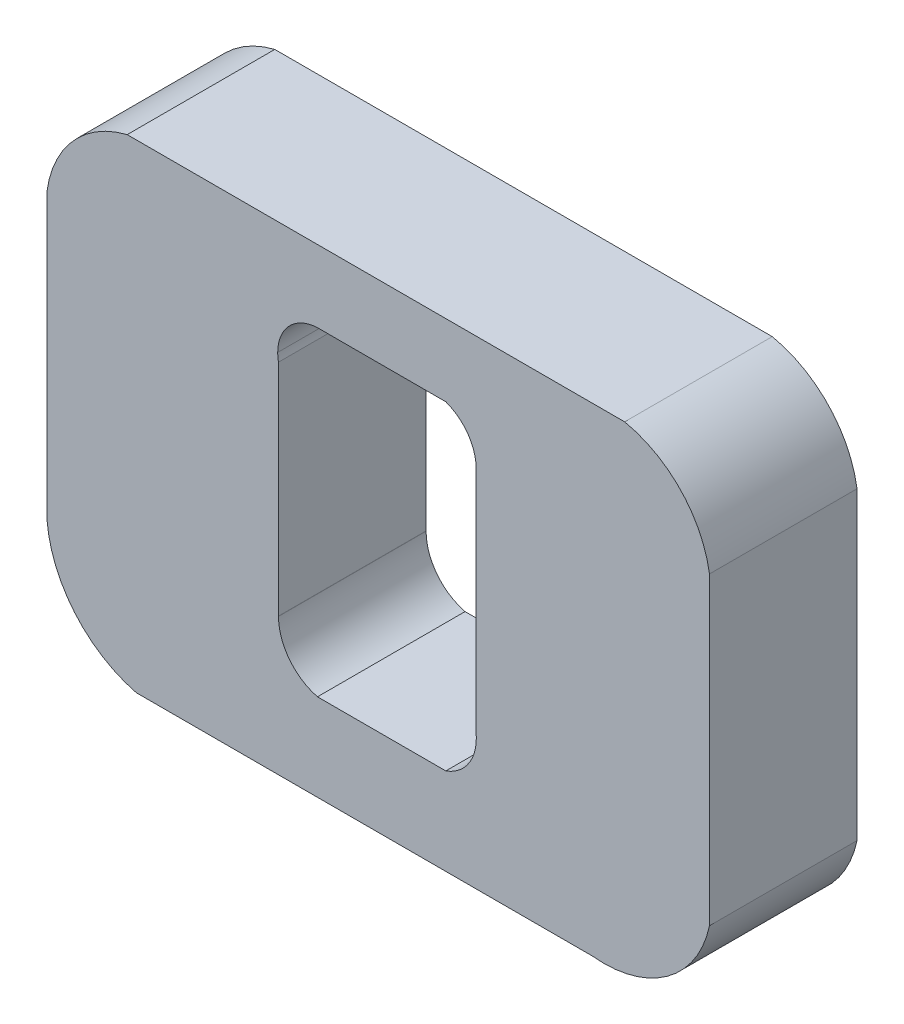
ISO-10303-21;
HEADER;
FILE_DESCRIPTION(('STEP AP214'),'2;1');
FILE_NAME('part.step','',(''),(''),'','','');
FILE_SCHEMA(('AUTOMOTIVE_DESIGN { 1 0 10303 214 1 1 1 1 }'));
ENDSEC;
DATA;
#1=APPLICATION_CONTEXT('core data for automotive mechanical design processes');
#2=APPLICATION_PROTOCOL_DEFINITION('international standard','automotive_design',2000,#1);
#3=PRODUCT_CONTEXT('',#1,'mechanical');
#4=PRODUCT('Part','Part','',(#3));
#5=PRODUCT_RELATED_PRODUCT_CATEGORY('part','',(#4));
#6=PRODUCT_DEFINITION_FORMATION('','',#4);
#7=PRODUCT_DEFINITION_CONTEXT('part definition',#1,'design');
#8=PRODUCT_DEFINITION('design','',#6,#7);
#9=PRODUCT_DEFINITION_SHAPE('','',#8);
#10=(LENGTH_UNIT() NAMED_UNIT(*) SI_UNIT(.MILLI.,.METRE.));
#11=(NAMED_UNIT(*) PLANE_ANGLE_UNIT() SI_UNIT($,.RADIAN.));
#12=(NAMED_UNIT(*) SI_UNIT($,.STERADIAN.) SOLID_ANGLE_UNIT());
#13=UNCERTAINTY_MEASURE_WITH_UNIT(LENGTH_MEASURE(1.E-05),#10,'distance_accuracy_value','');
#14=(GEOMETRIC_REPRESENTATION_CONTEXT(3) GLOBAL_UNCERTAINTY_ASSIGNED_CONTEXT((#13)) GLOBAL_UNIT_ASSIGNED_CONTEXT((#10,
#11,#12)) REPRESENTATION_CONTEXT('',''));
#15=CARTESIAN_POINT('',(0.,0.,0.));
#16=DIRECTION('',(0.,0.,1.));
#17=DIRECTION('',(1.,0.,0.));
#18=AXIS2_PLACEMENT_3D('',#15,#16,#17);
#19=CARTESIAN_POINT('',(-1.9393635236932,-18.1793191476775,69.4720552155059));
#20=DIRECTION('',(0.,0.,1.));
#21=DIRECTION('',(1.,0.,0.));
#22=AXIS2_PLACEMENT_3D('',#19,#20,#21);
#23=PLANE('',#22);
#24=DIRECTION('',(0.,-1.,0.));
#25=VECTOR('',#24,1.);
#26=CARTESIAN_POINT('',(-1.64471093498357,-17.5480655434369,69.4720552155059));
#27=LINE('',#26,#25);
#28=CARTESIAN_POINT('',(-1.64471093498357,-17.5480655434369,69.4720552155059));
#29=VERTEX_POINT('',#28);
#30=CARTESIAN_POINT('',(-1.64471093498357,-18.1217081782463,69.4720552155059));
#31=VERTEX_POINT('',#30);
#32=EDGE_CURVE('E385',#29,#31,#27,.T.);
#33=ORIENTED_EDGE('',*,*,#32,.T.);
#34=CARTESIAN_POINT('',(-1.50987489194818,-18.1224763428825,69.4720552155059));
#35=DIRECTION('',(0.,0.,1.));
#36=DIRECTION('',(1.,0.,0.));
#37=AXIS2_PLACEMENT_3D('',#34,#35,#36);
#38=CIRCLE('',#37,0.134838231145121);
#39=CARTESIAN_POINT('',(-1.6447131230933,-18.1224763428825,69.4720552155059));
#40=VERTEX_POINT('',#39);
#41=EDGE_CURVE('E317',#31,#40,#38,.T.);
#42=ORIENTED_EDGE('',*,*,#41,.T.);
#43=CARTESIAN_POINT('',(-1.50987489194818,-18.1224763428825,69.4720552155059));
#44=DIRECTION('',(0.,0.,1.));
#45=DIRECTION('',(1.,0.,0.));
#46=AXIS2_PLACEMENT_3D('',#43,#44,#45);
#47=CIRCLE('',#46,0.134838231145121);
#48=CARTESIAN_POINT('',(-1.54305702823963,-18.253167943261,69.4720552155059));
#49=VERTEX_POINT('',#48);
#50=EDGE_CURVE('E11',#40,#49,#47,.T.);
#51=ORIENTED_EDGE('',*,*,#50,.T.);
#52=DIRECTION('',(1.,0.,0.));
#53=VECTOR('',#52,1.);
#54=CARTESIAN_POINT('',(-1.54305702823869,-18.2531679432618,69.4720552155059));
#55=LINE('',#54,#53);
#56=CARTESIAN_POINT('',(-1.20819730965096,-18.2531679432618,69.4720552155059));
#57=VERTEX_POINT('',#56);
#58=EDGE_CURVE('E215',#49,#57,#55,.T.);
#59=ORIENTED_EDGE('',*,*,#58,.T.);
#60=CARTESIAN_POINT('',(-1.24873255736193,-18.1401110956377,69.4720552155059));
#61=DIRECTION('',(0.,0.,1.));
#62=DIRECTION('',(1.,0.,0.));
#63=AXIS2_PLACEMENT_3D('',#60,#61,#62);
#64=CIRCLE('',#63,0.120103942905845);
#65=CARTESIAN_POINT('',(-1.13004688117047,-18.1217081782465,69.4720552155059));
#66=VERTEX_POINT('',#65);
#67=EDGE_CURVE('E205',#57,#66,#64,.T.);
#68=ORIENTED_EDGE('',*,*,#67,.T.);
#69=DIRECTION('',(0.,1.,0.));
#70=VECTOR('',#69,1.);
#71=CARTESIAN_POINT('',(-1.13004688117,-18.1217081782463,69.4720552155059));
#72=LINE('',#71,#70);
#73=CARTESIAN_POINT('',(-1.13004688117,-17.5480655434369,69.4720552155059));
#74=VERTEX_POINT('',#73);
#75=EDGE_CURVE('E197',#66,#74,#72,.T.);
#76=ORIENTED_EDGE('',*,*,#75,.T.);
#77=CARTESIAN_POINT('',(-1.24807334481727,-17.5316071274858,69.4720552155059));
#78=DIRECTION('',(0.,0.,1.));
#79=DIRECTION('',(1.,0.,0.));
#80=AXIS2_PLACEMENT_3D('',#77,#78,#79);
#81=CIRCLE('',#80,0.119168475599196);
#82=CARTESIAN_POINT('',(-1.2081973096505,-17.4193082966993,69.4720552155059));
#83=VERTEX_POINT('',#82);
#84=EDGE_CURVE('E329',#74,#83,#81,.T.);
#85=ORIENTED_EDGE('',*,*,#84,.T.);
#86=DIRECTION('',(-1.,0.,0.));
#87=VECTOR('',#86,1.);
#88=CARTESIAN_POINT('',(-1.20819730965096,-17.4193082966993,69.4720552155059));
#89=LINE('',#88,#87);
#90=CARTESIAN_POINT('',(-1.54305702823869,-17.4193082966993,69.4720552155059));
#91=VERTEX_POINT('',#90);
#92=EDGE_CURVE('E333',#83,#91,#89,.T.);
#93=ORIENTED_EDGE('',*,*,#92,.T.);
#94=CARTESIAN_POINT('',(-1.53893723371053,-17.5270674033295,69.4720552155059));
#95=DIRECTION('',(0.,0.,1.));
#96=DIRECTION('',(1.,0.,0.));
#97=AXIS2_PLACEMENT_3D('',#94,#95,#96);
#98=CIRCLE('',#97,0.107837830879786);
#99=CARTESIAN_POINT('',(-1.64677506459031,-17.5270674033295,69.4720552155059));
#100=VERTEX_POINT('',#99);
#101=EDGE_CURVE('E381',#91,#100,#98,.T.);
#102=ORIENTED_EDGE('',*,*,#101,.T.);
#103=CARTESIAN_POINT('',(-1.53893723371053,-17.5270674033295,69.4720552155059));
#104=DIRECTION('',(0.,0.,1.));
#105=DIRECTION('',(1.,0.,0.));
#106=AXIS2_PLACEMENT_3D('',#103,#104,#105);
#107=CIRCLE('',#106,0.107837830879786);
#108=EDGE_CURVE('E357',#100,#29,#107,.T.);
#109=ORIENTED_EDGE('',*,*,#108,.T.);
#110=EDGE_LOOP('',(#33,#42,#51,#59,#68,#76,#85,#93,#102,#109));
#111=FACE_BOUND('',#110,.T.);
#112=DIRECTION('',(0.,-1.,0.));
#113=VECTOR('',#112,1.);
#114=CARTESIAN_POINT('',(-2.24865435820097,-17.4644093007314,69.4720552155059));
#115=LINE('',#114,#113);
#116=CARTESIAN_POINT('',(-2.24865435820097,-17.4644093007314,69.4720552155059));
#117=VERTEX_POINT('',#116);
#118=CARTESIAN_POINT('',(-2.24865435820097,-18.2053644209517,69.4720552155059));
#119=VERTEX_POINT('',#118);
#120=EDGE_CURVE('E225',#117,#119,#115,.T.);
#121=ORIENTED_EDGE('',*,*,#120,.F.);
#122=CARTESIAN_POINT('',(-1.97311280833625,-17.5013656888224,69.4720552155059));
#123=DIRECTION('',(0.,0.,1.));
#124=DIRECTION('',(1.,0.,0.));
#125=AXIS2_PLACEMENT_3D('',#122,#123,#124);
#126=CIRCLE('',#125,0.278008849360009);
#127=CARTESIAN_POINT('',(-2.03936701873062,-17.2313669852569,69.4720552155059));
#128=VERTEX_POINT('',#127);
#129=EDGE_CURVE('E167',#128,#117,#126,.T.);
#130=ORIENTED_EDGE('',*,*,#129,.F.);
#131=DIRECTION('',(-1.,0.,0.));
#132=VECTOR('',#131,1.);
#133=CARTESIAN_POINT('',(-0.741785563146615,-17.2313669852569,69.4720552155059));
#134=LINE('',#133,#132);
#135=CARTESIAN_POINT('',(-0.74178556314646,-17.2313669852567,69.4720552155059));
#136=VERTEX_POINT('',#135);
#137=EDGE_CURVE('E161',#136,#128,#134,.T.);
#138=ORIENTED_EDGE('',*,*,#137,.F.);
#139=CARTESIAN_POINT('',(-0.799573066802852,-17.5077746768139,69.4720552155059));
#140=DIRECTION('',(0.,0.,1.));
#141=DIRECTION('',(1.,0.,0.));
#142=AXIS2_PLACEMENT_3D('',#139,#140,#141);
#143=CIRCLE('',#142,0.282383794738376);
#144=CARTESIAN_POINT('',(-0.520538926080152,-17.4644093007314,69.4720552155059));
#145=VERTEX_POINT('',#144);
#146=EDGE_CURVE('E165',#145,#136,#143,.T.);
#147=ORIENTED_EDGE('',*,*,#146,.F.);
#148=DIRECTION('',(0.,1.,0.));
#149=VECTOR('',#148,1.);
#150=CARTESIAN_POINT('',(-0.520538926080152,-18.2591433966606,69.4720552155059));
#151=LINE('',#150,#149);
#152=CARTESIAN_POINT('',(-0.520538926080152,-18.2591433966603,69.4720552155059));
#153=VERTEX_POINT('',#152);
#154=EDGE_CURVE('E277',#153,#145,#151,.T.);
#155=ORIENTED_EDGE('',*,*,#154,.F.);
#156=CARTESIAN_POINT('',(-0.795650136791128,-18.2005393562921,69.4720552155059));
#157=DIRECTION('',(0.,0.,1.));
#158=DIRECTION('',(1.,0.,0.));
#159=AXIS2_PLACEMENT_3D('',#156,#157,#158);
#160=CIRCLE('',#159,0.281283863394903);
#161=CARTESIAN_POINT('',(-0.825500400679682,-18.4802348577797,69.4720552155059));
#162=VERTEX_POINT('',#161);
#163=EDGE_CURVE('E265',#162,#153,#160,.T.);
#164=ORIENTED_EDGE('',*,*,#163,.F.);
#165=DIRECTION('',(1.,0.,0.));
#166=VECTOR('',#165,1.);
#167=CARTESIAN_POINT('',(-2.01544842354118,-18.4802348577797,69.4720552155059));
#168=LINE('',#167,#166);
#169=CARTESIAN_POINT('',(-2.01544842354118,-18.4802348577794,69.4720552155059));
#170=VERTEX_POINT('',#169);
#171=EDGE_CURVE('E253',#170,#162,#168,.T.);
#172=ORIENTED_EDGE('',*,*,#171,.F.);
#173=CARTESIAN_POINT('',(-1.9393635236932,-18.1793191476775,69.4720552155059));
#174=DIRECTION('',(0.,0.,1.));
#175=DIRECTION('',(1.,0.,0.));
#176=AXIS2_PLACEMENT_3D('',#173,#174,#175);
#177=CIRCLE('',#176,0.310385528933008);
#178=EDGE_CURVE('E241',#119,#170,#177,.T.);
#179=ORIENTED_EDGE('',*,*,#178,.F.);
#180=EDGE_LOOP('',(#121,#130,#138,#147,#155,#164,#172,#179));
#181=FACE_BOUND('',#180,.T.);
#182=ADVANCED_FACE('F17',(#111,#181),#23,.F.);
#183=CARTESIAN_POINT('',(-1.9393635236932,-18.1793191476775,69.8570552155059));
#184=DIRECTION('',(0.,0.,1.));
#185=DIRECTION('',(1.,0.,0.));
#186=AXIS2_PLACEMENT_3D('',#183,#184,#185);
#187=PLANE('',#186);
#188=DIRECTION('',(0.,-1.,0.));
#189=VECTOR('',#188,1.);
#190=CARTESIAN_POINT('',(-1.64471093498357,-17.5480655434369,69.8570552155059));
#191=LINE('',#190,#189);
#192=CARTESIAN_POINT('',(-1.64471093498357,-17.5480655434369,69.8570552155059));
#193=VERTEX_POINT('',#192);
#194=CARTESIAN_POINT('',(-1.64471093498357,-18.1217081782463,69.8570552155059));
#195=VERTEX_POINT('',#194);
#196=EDGE_CURVE('E393',#193,#195,#191,.T.);
#197=ORIENTED_EDGE('',*,*,#196,.F.);
#198=CARTESIAN_POINT('',(-1.53893723371053,-17.5270674033295,69.8570552155059));
#199=DIRECTION('',(0.,0.,1.));
#200=DIRECTION('',(0.,-1.,0.));
#201=AXIS2_PLACEMENT_3D('',#198,#199,#200);
#202=CIRCLE('',#201,0.107837830879785);
#203=CARTESIAN_POINT('',(-1.64677506459031,-17.5270674033295,69.8570552155059));
#204=VERTEX_POINT('',#203);
#205=EDGE_CURVE('E363',#204,#193,#202,.T.);
#206=ORIENTED_EDGE('',*,*,#205,.F.);
#207=CARTESIAN_POINT('',(-1.53893723371053,-17.5270674033295,69.8570552155059));
#208=DIRECTION('',(0.,0.,1.));
#209=DIRECTION('',(0.,-1.,0.));
#210=AXIS2_PLACEMENT_3D('',#207,#208,#209);
#211=CIRCLE('',#210,0.107837830879785);
#212=CARTESIAN_POINT('',(-1.54305702823869,-17.4193082966993,69.8570552155059));
#213=VERTEX_POINT('',#212);
#214=EDGE_CURVE('E373',#213,#204,#211,.T.);
#215=ORIENTED_EDGE('',*,*,#214,.F.);
#216=DIRECTION('',(-1.,0.,0.));
#217=VECTOR('',#216,1.);
#218=CARTESIAN_POINT('',(-1.20819730965096,-17.4193082966993,69.8570552155059));
#219=LINE('',#218,#217);
#220=CARTESIAN_POINT('',(-1.2081973096505,-17.4193082966993,69.8570552155059));
#221=VERTEX_POINT('',#220);
#222=EDGE_CURVE('E341',#221,#213,#219,.T.);
#223=ORIENTED_EDGE('',*,*,#222,.F.);
#224=CARTESIAN_POINT('',(-1.24807334481727,-17.5316071274858,69.8570552155059));
#225=DIRECTION('',(0.,0.,1.));
#226=DIRECTION('',(0.,-1.,0.));
#227=AXIS2_PLACEMENT_3D('',#224,#225,#226);
#228=CIRCLE('',#227,0.119168475599195);
#229=CARTESIAN_POINT('',(-1.13004688117,-17.5480655434369,69.8570552155059));
#230=VERTEX_POINT('',#229);
#231=EDGE_CURVE('E347',#230,#221,#228,.T.);
#232=ORIENTED_EDGE('',*,*,#231,.F.);
#233=DIRECTION('',(0.,1.,0.));
#234=VECTOR('',#233,1.);
#235=CARTESIAN_POINT('',(-1.13004688117,-18.1217081782463,69.8570552155059));
#236=LINE('',#235,#234);
#237=CARTESIAN_POINT('',(-1.13004688117047,-18.1217081782465,69.8570552155059));
#238=VERTEX_POINT('',#237);
#239=EDGE_CURVE('E202',#238,#230,#236,.T.);
#240=ORIENTED_EDGE('',*,*,#239,.F.);
#241=CARTESIAN_POINT('',(-1.24873255736193,-18.1401110956377,69.8570552155059));
#242=DIRECTION('',(0.,0.,1.));
#243=DIRECTION('',(0.,-1.,0.));
#244=AXIS2_PLACEMENT_3D('',#241,#242,#243);
#245=CIRCLE('',#244,0.120103942905844);
#246=CARTESIAN_POINT('',(-1.20819730965096,-18.2531679432618,69.8570552155059));
#247=VERTEX_POINT('',#246);
#248=EDGE_CURVE('E212',#247,#238,#245,.T.);
#249=ORIENTED_EDGE('',*,*,#248,.F.);
#250=DIRECTION('',(1.,0.,0.));
#251=VECTOR('',#250,1.);
#252=CARTESIAN_POINT('',(-1.54305702823869,-18.2531679432618,69.8570552155059));
#253=LINE('',#252,#251);
#254=CARTESIAN_POINT('',(-1.54305702823963,-18.253167943261,69.8570552155059));
#255=VERTEX_POINT('',#254);
#256=EDGE_CURVE('E222',#255,#247,#253,.T.);
#257=ORIENTED_EDGE('',*,*,#256,.F.);
#258=CARTESIAN_POINT('',(-1.50987489194818,-18.1224763428825,69.8570552155059));
#259=DIRECTION('',(0.,0.,1.));
#260=DIRECTION('',(0.,-1.,0.));
#261=AXIS2_PLACEMENT_3D('',#258,#259,#260);
#262=CIRCLE('',#261,0.134838231145122);
#263=CARTESIAN_POINT('',(-1.6447131230933,-18.1224763428825,69.8570552155059));
#264=VERTEX_POINT('',#263);
#265=EDGE_CURVE('E26',#264,#255,#262,.T.);
#266=ORIENTED_EDGE('',*,*,#265,.F.);
#267=CARTESIAN_POINT('',(-1.50987489194818,-18.1224763428825,69.8570552155059));
#268=DIRECTION('',(0.,0.,1.));
#269=DIRECTION('',(0.,-1.,0.));
#270=AXIS2_PLACEMENT_3D('',#267,#268,#269);
#271=CIRCLE('',#270,0.134838231145122);
#272=EDGE_CURVE('E511',#195,#264,#271,.T.);
#273=ORIENTED_EDGE('',*,*,#272,.F.);
#274=EDGE_LOOP('',(#197,#206,#215,#223,#232,#240,#249,#257,#266,#273));
#275=FACE_BOUND('',#274,.T.);
#276=DIRECTION('',(0.,-1.,0.));
#277=VECTOR('',#276,1.);
#278=CARTESIAN_POINT('',(-2.24865435820097,-17.4644093007314,69.8570552155059));
#279=LINE('',#278,#277);
#280=CARTESIAN_POINT('',(-2.24865435820097,-17.4644093007314,69.8570552155059));
#281=VERTEX_POINT('',#280);
#282=CARTESIAN_POINT('',(-2.24865435820097,-18.2053644209517,69.8570552155059));
#283=VERTEX_POINT('',#282);
#284=EDGE_CURVE('E233',#281,#283,#279,.T.);
#285=ORIENTED_EDGE('',*,*,#284,.T.);
#286=CARTESIAN_POINT('',(-1.9393635236932,-18.1793191476775,69.8570552155059));
#287=DIRECTION('',(0.,0.,1.));
#288=DIRECTION('',(0.,-1.,0.));
#289=AXIS2_PLACEMENT_3D('',#286,#287,#288);
#290=CIRCLE('',#289,0.310385528933008);
#291=CARTESIAN_POINT('',(-2.01544842354118,-18.4802348577794,69.8570552155059));
#292=VERTEX_POINT('',#291);
#293=EDGE_CURVE('E249',#283,#292,#290,.T.);
#294=ORIENTED_EDGE('',*,*,#293,.T.);
#295=DIRECTION('',(1.,0.,0.));
#296=VECTOR('',#295,1.);
#297=CARTESIAN_POINT('',(-2.01544842354118,-18.4802348577797,69.8570552155059));
#298=LINE('',#297,#296);
#299=CARTESIAN_POINT('',(-0.825500400679682,-18.4802348577797,69.8570552155059));
#300=VERTEX_POINT('',#299);
#301=EDGE_CURVE('E261',#292,#300,#298,.T.);
#302=ORIENTED_EDGE('',*,*,#301,.T.);
#303=CARTESIAN_POINT('',(-0.795650136791128,-18.2005393562921,69.8570552155059));
#304=DIRECTION('',(0.,0.,1.));
#305=DIRECTION('',(0.,-1.,0.));
#306=AXIS2_PLACEMENT_3D('',#303,#304,#305);
#307=CIRCLE('',#306,0.281283863394904);
#308=CARTESIAN_POINT('',(-0.520538926080152,-18.2591433966603,69.8570552155059));
#309=VERTEX_POINT('',#308);
#310=EDGE_CURVE('E273',#300,#309,#307,.T.);
#311=ORIENTED_EDGE('',*,*,#310,.T.);
#312=DIRECTION('',(0.,1.,0.));
#313=VECTOR('',#312,1.);
#314=CARTESIAN_POINT('',(-0.520538926080152,-18.2591433966606,69.8570552155059));
#315=LINE('',#314,#313);
#316=CARTESIAN_POINT('',(-0.520538926080152,-17.4644093007314,69.8570552155059));
#317=VERTEX_POINT('',#316);
#318=EDGE_CURVE('E187',#309,#317,#315,.T.);
#319=ORIENTED_EDGE('',*,*,#318,.T.);
#320=CARTESIAN_POINT('',(-0.799573066802852,-17.5077746768139,69.8570552155059));
#321=DIRECTION('',(0.,0.,1.));
#322=DIRECTION('',(0.,-1.,0.));
#323=AXIS2_PLACEMENT_3D('',#320,#321,#322);
#324=CIRCLE('',#323,0.282383794738376);
#325=CARTESIAN_POINT('',(-0.74178556314646,-17.2313669852567,69.8570552155059));
#326=VERTEX_POINT('',#325);
#327=EDGE_CURVE('E172',#317,#326,#324,.T.);
#328=ORIENTED_EDGE('',*,*,#327,.T.);
#329=DIRECTION('',(-1.,0.,0.));
#330=VECTOR('',#329,1.);
#331=CARTESIAN_POINT('',(-0.741785563146615,-17.2313669852569,69.8570552155059));
#332=LINE('',#331,#330);
#333=CARTESIAN_POINT('',(-2.03936701873062,-17.2313669852569,69.8570552155059));
#334=VERTEX_POINT('',#333);
#335=EDGE_CURVE('E177',#326,#334,#332,.T.);
#336=ORIENTED_EDGE('',*,*,#335,.T.);
#337=CARTESIAN_POINT('',(-1.97311280833625,-17.5013656888224,69.8570552155059));
#338=DIRECTION('',(0.,0.,1.));
#339=DIRECTION('',(0.,-1.,0.));
#340=AXIS2_PLACEMENT_3D('',#337,#338,#339);
#341=CIRCLE('',#340,0.278008849360009);
#342=EDGE_CURVE('E38',#334,#281,#341,.T.);
#343=ORIENTED_EDGE('',*,*,#342,.T.);
#344=EDGE_LOOP('',(#285,#294,#302,#311,#319,#328,#336,#343));
#345=FACE_BOUND('',#344,.T.);
#346=ADVANCED_FACE('F305',(#275,#345),#187,.T.);
#347=CARTESIAN_POINT('',(-1.50987489194818,-18.1224763428825,69.8220552155059));
#348=DIRECTION('',(0.,0.,-1.));
#349=DIRECTION('',(-1.,0.,0.));
#350=AXIS2_PLACEMENT_3D('',#347,#348,#349);
#351=CYLINDRICAL_SURFACE('',#350,0.134838231145121);
#352=DIRECTION('',(0.,0.,-1.));
#353=VECTOR('',#352,1.);
#354=CARTESIAN_POINT('',(-1.6447131230933,-18.1224763428825,69.8220552155059));
#355=LINE('',#354,#353);
#356=EDGE_CURVE('E299',#264,#40,#355,.T.);
#357=ORIENTED_EDGE('',*,*,#356,.F.);
#358=ORIENTED_EDGE('',*,*,#265,.T.);
#359=DIRECTION('',(0.,0.,-1.));
#360=VECTOR('',#359,1.);
#361=CARTESIAN_POINT('',(-1.54305702823963,-18.253167943261,69.8220552155059));
#362=LINE('',#361,#360);
#363=EDGE_CURVE('E218',#255,#49,#362,.T.);
#364=ORIENTED_EDGE('',*,*,#363,.T.);
#365=ORIENTED_EDGE('',*,*,#50,.F.);
#366=EDGE_LOOP('',(#357,#358,#364,#365));
#367=FACE_BOUND('',#366,.T.);
#368=ADVANCED_FACE('F293',(#367),#351,.F.);
#369=CARTESIAN_POINT('',(-1.97311280833625,-17.5013656888224,69.8220552155059));
#370=DIRECTION('',(0.,0.,-1.));
#371=DIRECTION('',(-1.,0.,0.));
#372=AXIS2_PLACEMENT_3D('',#369,#370,#371);
#373=CYLINDRICAL_SURFACE('',#372,0.278008849360009);
#374=ORIENTED_EDGE('',*,*,#129,.T.);
#375=DIRECTION('',(0.,0.,-1.));
#376=VECTOR('',#375,1.);
#377=CARTESIAN_POINT('',(-2.24865435820097,-17.4644093007314,69.8220552155059));
#378=LINE('',#377,#376);
#379=EDGE_CURVE('E237',#281,#117,#378,.T.);
#380=ORIENTED_EDGE('',*,*,#379,.F.);
#381=ORIENTED_EDGE('',*,*,#342,.F.);
#382=DIRECTION('',(0.,0.,-1.));
#383=VECTOR('',#382,1.);
#384=CARTESIAN_POINT('',(-2.03936701873062,-17.2313669852569,69.8220552155059));
#385=LINE('',#384,#383);
#386=EDGE_CURVE('E171',#334,#128,#385,.T.);
#387=ORIENTED_EDGE('',*,*,#386,.T.);
#388=EDGE_LOOP('',(#374,#380,#381,#387));
#389=FACE_BOUND('',#388,.T.);
#390=ADVANCED_FACE('F425',(#389),#373,.T.);
#391=CARTESIAN_POINT('',(-0.741785563146615,-17.2313669852569,69.8220552155059));
#392=DIRECTION('',(0.,-1.,0.));
#393=DIRECTION('',(0.,0.,-1.));
#394=AXIS2_PLACEMENT_3D('',#391,#392,#393);
#395=PLANE('',#394);
#396=ORIENTED_EDGE('',*,*,#137,.T.);
#397=ORIENTED_EDGE('',*,*,#386,.F.);
#398=ORIENTED_EDGE('',*,*,#335,.F.);
#399=DIRECTION('',(0.,0.,-1.));
#400=VECTOR('',#399,1.);
#401=CARTESIAN_POINT('',(-0.74178556314646,-17.2313669852567,69.8220552155059));
#402=LINE('',#401,#400);
#403=EDGE_CURVE('E175',#326,#136,#402,.T.);
#404=ORIENTED_EDGE('',*,*,#403,.T.);
#405=EDGE_LOOP('',(#396,#397,#398,#404));
#406=FACE_BOUND('',#405,.T.);
#407=ADVANCED_FACE('F176',(#406),#395,.F.);
#408=CARTESIAN_POINT('',(-0.799573066802852,-17.5077746768139,69.8220552155059));
#409=DIRECTION('',(0.,0.,-1.));
#410=DIRECTION('',(-1.,0.,0.));
#411=AXIS2_PLACEMENT_3D('',#408,#409,#410);
#412=CYLINDRICAL_SURFACE('',#411,0.282383794738376);
#413=ORIENTED_EDGE('',*,*,#146,.T.);
#414=ORIENTED_EDGE('',*,*,#403,.F.);
#415=ORIENTED_EDGE('',*,*,#327,.F.);
#416=DIRECTION('',(0.,0.,-1.));
#417=VECTOR('',#416,1.);
#418=CARTESIAN_POINT('',(-0.520538926080152,-17.4644093007314,69.8220552155059));
#419=LINE('',#418,#417);
#420=EDGE_CURVE('E184',#317,#145,#419,.T.);
#421=ORIENTED_EDGE('',*,*,#420,.T.);
#422=EDGE_LOOP('',(#413,#414,#415,#421));
#423=FACE_BOUND('',#422,.T.);
#424=ADVANCED_FACE('F182',(#423),#412,.T.);
#425=CARTESIAN_POINT('',(-0.520538926080152,-18.2591433966606,69.8220552155059));
#426=DIRECTION('',(-1.,0.,0.));
#427=DIRECTION('',(0.,0.,1.));
#428=AXIS2_PLACEMENT_3D('',#425,#426,#427);
#429=PLANE('',#428);
#430=ORIENTED_EDGE('',*,*,#154,.T.);
#431=ORIENTED_EDGE('',*,*,#420,.F.);
#432=ORIENTED_EDGE('',*,*,#318,.F.);
#433=DIRECTION('',(0.,0.,-1.));
#434=VECTOR('',#433,1.);
#435=CARTESIAN_POINT('',(-0.520538926080152,-18.2591433966603,69.8220552155059));
#436=LINE('',#435,#434);
#437=EDGE_CURVE('E269',#309,#153,#436,.T.);
#438=ORIENTED_EDGE('',*,*,#437,.T.);
#439=EDGE_LOOP('',(#430,#431,#432,#438));
#440=FACE_BOUND('',#439,.T.);
#441=ADVANCED_FACE('F436',(#440),#429,.F.);
#442=CARTESIAN_POINT('',(-0.795650136791128,-18.2005393562921,69.8220552155059));
#443=DIRECTION('',(0.,0.,-1.));
#444=DIRECTION('',(-1.,0.,0.));
#445=AXIS2_PLACEMENT_3D('',#442,#443,#444);
#446=CYLINDRICAL_SURFACE('',#445,0.281283863394903);
#447=ORIENTED_EDGE('',*,*,#163,.T.);
#448=ORIENTED_EDGE('',*,*,#437,.F.);
#449=ORIENTED_EDGE('',*,*,#310,.F.);
#450=DIRECTION('',(0.,0.,-1.));
#451=VECTOR('',#450,1.);
#452=CARTESIAN_POINT('',(-0.825500400679682,-18.4802348577797,69.8220552155059));
#453=LINE('',#452,#451);
#454=EDGE_CURVE('E257',#300,#162,#453,.T.);
#455=ORIENTED_EDGE('',*,*,#454,.T.);
#456=EDGE_LOOP('',(#447,#448,#449,#455));
#457=FACE_BOUND('',#456,.T.);
#458=ADVANCED_FACE('F439',(#457),#446,.T.);
#459=CARTESIAN_POINT('',(-2.01544842354118,-18.4802348577797,69.8220552155059));
#460=DIRECTION('',(0.,1.,0.));
#461=DIRECTION('',(1.,0.,0.));
#462=AXIS2_PLACEMENT_3D('',#459,#460,#461);
#463=PLANE('',#462);
#464=ORIENTED_EDGE('',*,*,#171,.T.);
#465=ORIENTED_EDGE('',*,*,#454,.F.);
#466=ORIENTED_EDGE('',*,*,#301,.F.);
#467=DIRECTION('',(0.,0.,-1.));
#468=VECTOR('',#467,1.);
#469=CARTESIAN_POINT('',(-2.01544842354118,-18.4802348577794,69.8220552155059));
#470=LINE('',#469,#468);
#471=EDGE_CURVE('E245',#292,#170,#470,.T.);
#472=ORIENTED_EDGE('',*,*,#471,.T.);
#473=EDGE_LOOP('',(#464,#465,#466,#472));
#474=FACE_BOUND('',#473,.T.);
#475=ADVANCED_FACE('F441',(#474),#463,.F.);
#476=CARTESIAN_POINT('',(-1.9393635236932,-18.1793191476775,69.8220552155059));
#477=DIRECTION('',(0.,0.,-1.));
#478=DIRECTION('',(-1.,0.,0.));
#479=AXIS2_PLACEMENT_3D('',#476,#477,#478);
#480=CYLINDRICAL_SURFACE('',#479,0.310385528933008);
#481=ORIENTED_EDGE('',*,*,#178,.T.);
#482=ORIENTED_EDGE('',*,*,#471,.F.);
#483=ORIENTED_EDGE('',*,*,#293,.F.);
#484=DIRECTION('',(0.,0.,-1.));
#485=VECTOR('',#484,1.);
#486=CARTESIAN_POINT('',(-2.24865435820097,-18.2053644209517,69.8220552155059));
#487=LINE('',#486,#485);
#488=EDGE_CURVE('E229',#283,#119,#487,.T.);
#489=ORIENTED_EDGE('',*,*,#488,.T.);
#490=EDGE_LOOP('',(#481,#482,#483,#489));
#491=FACE_BOUND('',#490,.T.);
#492=ADVANCED_FACE('F433',(#491),#480,.T.);
#493=CARTESIAN_POINT('',(-2.24865435820097,-17.4644093007314,69.8220552155059));
#494=DIRECTION('',(1.,0.,0.));
#495=DIRECTION('',(0.,1.,0.));
#496=AXIS2_PLACEMENT_3D('',#493,#494,#495);
#497=PLANE('',#496);
#498=ORIENTED_EDGE('',*,*,#120,.T.);
#499=ORIENTED_EDGE('',*,*,#488,.F.);
#500=ORIENTED_EDGE('',*,*,#284,.F.);
#501=ORIENTED_EDGE('',*,*,#379,.T.);
#502=EDGE_LOOP('',(#498,#499,#500,#501));
#503=FACE_BOUND('',#502,.T.);
#504=ADVANCED_FACE('F429',(#503),#497,.F.);
#505=CARTESIAN_POINT('',(-1.54305702823869,-18.2531679432618,69.8220552155059));
#506=DIRECTION('',(0.,1.,0.));
#507=DIRECTION('',(1.,0.,0.));
#508=AXIS2_PLACEMENT_3D('',#505,#506,#507);
#509=PLANE('',#508);
#510=ORIENTED_EDGE('',*,*,#58,.F.);
#511=ORIENTED_EDGE('',*,*,#363,.F.);
#512=ORIENTED_EDGE('',*,*,#256,.T.);
#513=DIRECTION('',(0.,0.,-1.));
#514=VECTOR('',#513,1.);
#515=CARTESIAN_POINT('',(-1.20819730965096,-18.2531679432618,69.8220552155059));
#516=LINE('',#515,#514);
#517=EDGE_CURVE('E208',#247,#57,#516,.T.);
#518=ORIENTED_EDGE('',*,*,#517,.T.);
#519=EDGE_LOOP('',(#510,#511,#512,#518));
#520=FACE_BOUND('',#519,.T.);
#521=ADVANCED_FACE('F310',(#520),#509,.T.);
#522=CARTESIAN_POINT('',(-1.24873255736193,-18.1401110956377,69.8220552155059));
#523=DIRECTION('',(0.,0.,-1.));
#524=DIRECTION('',(-1.,0.,0.));
#525=AXIS2_PLACEMENT_3D('',#522,#523,#524);
#526=CYLINDRICAL_SURFACE('',#525,0.120103942905845);
#527=ORIENTED_EDGE('',*,*,#67,.F.);
#528=ORIENTED_EDGE('',*,*,#517,.F.);
#529=ORIENTED_EDGE('',*,*,#248,.T.);
#530=DIRECTION('',(0.,0.,-1.));
#531=VECTOR('',#530,1.);
#532=CARTESIAN_POINT('',(-1.13004688117047,-18.1217081782465,69.8220552155059));
#533=LINE('',#532,#531);
#534=EDGE_CURVE('E199',#238,#66,#533,.T.);
#535=ORIENTED_EDGE('',*,*,#534,.T.);
#536=EDGE_LOOP('',(#527,#528,#529,#535));
#537=FACE_BOUND('',#536,.T.);
#538=ADVANCED_FACE('F472',(#537),#526,.F.);
#539=CARTESIAN_POINT('',(-1.13004688117,-18.1217081782463,69.8220552155059));
#540=DIRECTION('',(-1.,0.,0.));
#541=DIRECTION('',(0.,0.,1.));
#542=AXIS2_PLACEMENT_3D('',#539,#540,#541);
#543=PLANE('',#542);
#544=ORIENTED_EDGE('',*,*,#75,.F.);
#545=ORIENTED_EDGE('',*,*,#534,.F.);
#546=ORIENTED_EDGE('',*,*,#239,.T.);
#547=DIRECTION('',(0.,0.,-1.));
#548=VECTOR('',#547,1.);
#549=CARTESIAN_POINT('',(-1.13004688117,-17.5480655434369,69.8220552155059));
#550=LINE('',#549,#548);
#551=EDGE_CURVE('E340',#230,#74,#550,.T.);
#552=ORIENTED_EDGE('',*,*,#551,.T.);
#553=EDGE_LOOP('',(#544,#545,#546,#552));
#554=FACE_BOUND('',#553,.T.);
#555=ADVANCED_FACE('F473',(#554),#543,.T.);
#556=CARTESIAN_POINT('',(-1.24807334481727,-17.5316071274858,69.8220552155059));
#557=DIRECTION('',(0.,0.,-1.));
#558=DIRECTION('',(-1.,0.,0.));
#559=AXIS2_PLACEMENT_3D('',#556,#557,#558);
#560=CYLINDRICAL_SURFACE('',#559,0.119168475599196);
#561=ORIENTED_EDGE('',*,*,#84,.F.);
#562=ORIENTED_EDGE('',*,*,#551,.F.);
#563=ORIENTED_EDGE('',*,*,#231,.T.);
#564=DIRECTION('',(0.,0.,-1.));
#565=VECTOR('',#564,1.);
#566=CARTESIAN_POINT('',(-1.2081973096505,-17.4193082966993,69.8220552155059));
#567=LINE('',#566,#565);
#568=EDGE_CURVE('E344',#221,#83,#567,.T.);
#569=ORIENTED_EDGE('',*,*,#568,.T.);
#570=EDGE_LOOP('',(#561,#562,#563,#569));
#571=FACE_BOUND('',#570,.T.);
#572=ADVANCED_FACE('F345',(#571),#560,.F.);
#573=CARTESIAN_POINT('',(-1.20819730965096,-17.4193082966993,69.8220552155059));
#574=DIRECTION('',(0.,-1.,0.));
#575=DIRECTION('',(0.,0.,-1.));
#576=AXIS2_PLACEMENT_3D('',#573,#574,#575);
#577=PLANE('',#576);
#578=ORIENTED_EDGE('',*,*,#92,.F.);
#579=ORIENTED_EDGE('',*,*,#568,.F.);
#580=ORIENTED_EDGE('',*,*,#222,.T.);
#581=DIRECTION('',(0.,0.,-1.));
#582=VECTOR('',#581,1.);
#583=CARTESIAN_POINT('',(-1.54305702823869,-17.4193082966993,69.8220552155059));
#584=LINE('',#583,#582);
#585=EDGE_CURVE('E354',#213,#91,#584,.T.);
#586=ORIENTED_EDGE('',*,*,#585,.T.);
#587=EDGE_LOOP('',(#578,#579,#580,#586));
#588=FACE_BOUND('',#587,.T.);
#589=ADVANCED_FACE('F352',(#588),#577,.T.);
#590=CARTESIAN_POINT('',(-1.53893723371053,-17.5270674033295,69.8220552155059));
#591=DIRECTION('',(0.,0.,-1.));
#592=DIRECTION('',(-1.,0.,0.));
#593=AXIS2_PLACEMENT_3D('',#590,#591,#592);
#594=CYLINDRICAL_SURFACE('',#593,0.107837830879786);
#595=DIRECTION('',(0.,0.,-1.));
#596=VECTOR('',#595,1.);
#597=CARTESIAN_POINT('',(-1.64677506459031,-17.5270674033295,69.8220552155059));
#598=LINE('',#597,#596);
#599=EDGE_CURVE('E377',#204,#100,#598,.T.);
#600=ORIENTED_EDGE('',*,*,#599,.F.);
#601=ORIENTED_EDGE('',*,*,#205,.T.);
#602=DIRECTION('',(0.,0.,-1.));
#603=VECTOR('',#602,1.);
#604=CARTESIAN_POINT('',(-1.64471093498357,-17.5480655434369,69.8220552155059));
#605=LINE('',#604,#603);
#606=EDGE_CURVE('E389',#193,#29,#605,.T.);
#607=ORIENTED_EDGE('',*,*,#606,.T.);
#608=ORIENTED_EDGE('',*,*,#108,.F.);
#609=EDGE_LOOP('',(#600,#601,#607,#608));
#610=FACE_BOUND('',#609,.T.);
#611=ADVANCED_FACE('F481',(#610),#594,.F.);
#612=CARTESIAN_POINT('',(-1.64471093498357,-17.5480655434369,69.8220552155059));
#613=DIRECTION('',(1.,0.,0.));
#614=DIRECTION('',(0.,1.,0.));
#615=AXIS2_PLACEMENT_3D('',#612,#613,#614);
#616=PLANE('',#615);
#617=ORIENTED_EDGE('',*,*,#32,.F.);
#618=ORIENTED_EDGE('',*,*,#606,.F.);
#619=ORIENTED_EDGE('',*,*,#196,.T.);
#620=DIRECTION('',(0.,0.,-1.));
#621=VECTOR('',#620,1.);
#622=CARTESIAN_POINT('',(-1.64471093498357,-18.1217081782463,69.8220552155059));
#623=LINE('',#622,#621);
#624=EDGE_CURVE('E368',#195,#31,#623,.T.);
#625=ORIENTED_EDGE('',*,*,#624,.T.);
#626=EDGE_LOOP('',(#617,#618,#619,#625));
#627=FACE_BOUND('',#626,.T.);
#628=ADVANCED_FACE('F485',(#627),#616,.T.);
#629=CARTESIAN_POINT('',(-1.53893723371053,-17.5270674033295,69.8220552155059));
#630=DIRECTION('',(0.,0.,-1.));
#631=DIRECTION('',(-1.,0.,0.));
#632=AXIS2_PLACEMENT_3D('',#629,#630,#631);
#633=CYLINDRICAL_SURFACE('',#632,0.107837830879786);
#634=ORIENTED_EDGE('',*,*,#214,.T.);
#635=ORIENTED_EDGE('',*,*,#599,.T.);
#636=ORIENTED_EDGE('',*,*,#101,.F.);
#637=ORIENTED_EDGE('',*,*,#585,.F.);
#638=EDGE_LOOP('',(#634,#635,#636,#637));
#639=FACE_BOUND('',#638,.T.);
#640=ADVANCED_FACE('F490',(#639),#633,.F.);
#641=CARTESIAN_POINT('',(-1.50987489194818,-18.1224763428825,69.8220552155059));
#642=DIRECTION('',(0.,0.,-1.));
#643=DIRECTION('',(-1.,0.,0.));
#644=AXIS2_PLACEMENT_3D('',#641,#642,#643);
#645=CYLINDRICAL_SURFACE('',#644,0.134838231145121);
#646=ORIENTED_EDGE('',*,*,#272,.T.);
#647=ORIENTED_EDGE('',*,*,#356,.T.);
#648=ORIENTED_EDGE('',*,*,#41,.F.);
#649=ORIENTED_EDGE('',*,*,#624,.F.);
#650=EDGE_LOOP('',(#646,#647,#648,#649));
#651=FACE_BOUND('',#650,.T.);
#652=ADVANCED_FACE('F497',(#651),#645,.F.);
#653=CLOSED_SHELL('',(#182,#346,#368,#390,#407,#424,#441,#458,#475,#492,#504,#521,#538,#555,
#572,#589,#611,#628,#640,#652));
#654=MANIFOLD_SOLID_BREP('B1',#653);
#655=ADVANCED_BREP_SHAPE_REPRESENTATION('',(#18,#654),#14);
#656=SHAPE_DEFINITION_REPRESENTATION(#9,#655);
ENDSEC;
END-ISO-10303-21;
